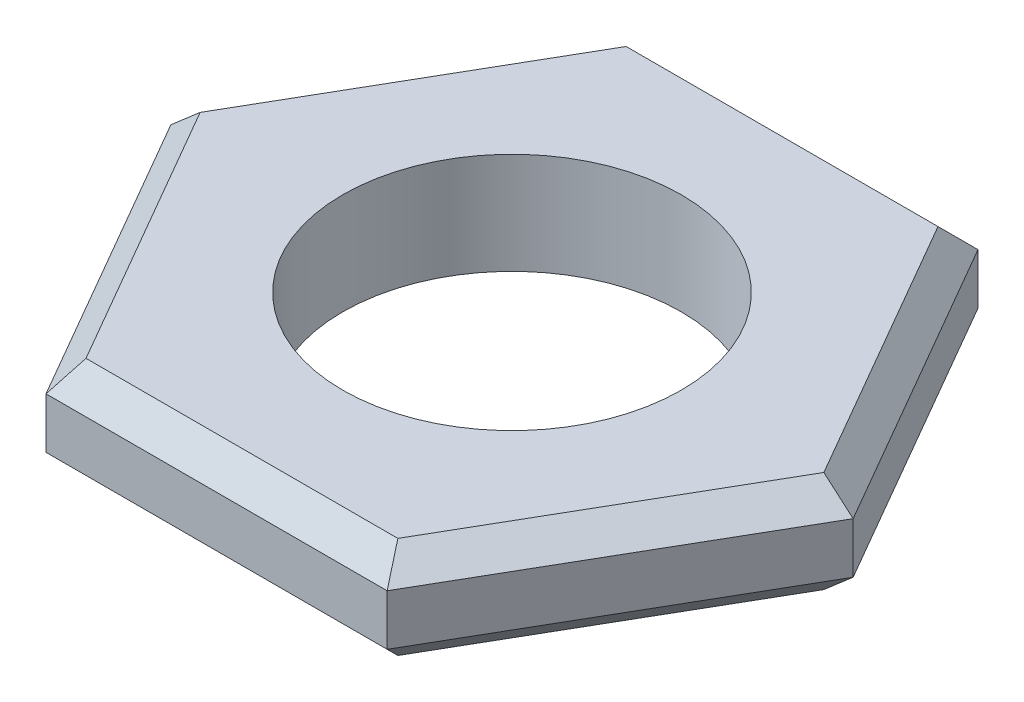
ISO-10303-21;
HEADER;
FILE_DESCRIPTION(('STEP AP214'),'2;1');
FILE_NAME('part.step','',(''),(''),'','','');
FILE_SCHEMA(('AUTOMOTIVE_DESIGN { 1 0 10303 214 1 1 1 1 }'));
ENDSEC;
DATA;
#1=APPLICATION_CONTEXT('core data for automotive mechanical design processes');
#2=APPLICATION_PROTOCOL_DEFINITION('international standard','automotive_design',2000,#1);
#3=PRODUCT_CONTEXT('',#1,'mechanical');
#4=PRODUCT('Part','Part','',(#3));
#5=PRODUCT_RELATED_PRODUCT_CATEGORY('part','',(#4));
#6=PRODUCT_DEFINITION_FORMATION('','',#4);
#7=PRODUCT_DEFINITION_CONTEXT('part definition',#1,'design');
#8=PRODUCT_DEFINITION('design','',#6,#7);
#9=PRODUCT_DEFINITION_SHAPE('','',#8);
#10=(LENGTH_UNIT() NAMED_UNIT(*) SI_UNIT(.MILLI.,.METRE.));
#11=(NAMED_UNIT(*) PLANE_ANGLE_UNIT() SI_UNIT($,.RADIAN.));
#12=(NAMED_UNIT(*) SI_UNIT($,.STERADIAN.) SOLID_ANGLE_UNIT());
#13=UNCERTAINTY_MEASURE_WITH_UNIT(LENGTH_MEASURE(1.E-05),#10,'distance_accuracy_value','');
#14=(GEOMETRIC_REPRESENTATION_CONTEXT(3) GLOBAL_UNCERTAINTY_ASSIGNED_CONTEXT((#13)) GLOBAL_UNIT_ASSIGNED_CONTEXT((#10,
#11,#12)) REPRESENTATION_CONTEXT('',''));
#15=CARTESIAN_POINT('',(0.,0.,0.));
#16=DIRECTION('',(0.,0.,1.));
#17=DIRECTION('',(1.,0.,0.));
#18=AXIS2_PLACEMENT_3D('',#15,#16,#17);
#19=CARTESIAN_POINT('',(0.,2.032,0.));
#20=DIRECTION('',(0.,1.,0.));
#21=DIRECTION('',(0.,0.,1.));
#22=AXIS2_PLACEMENT_3D('',#19,#20,#21);
#23=PLANE('',#22);
#24=DIRECTION('',(1.,0.,0.));
#25=VECTOR('',#24,1.);
#26=CARTESIAN_POINT('',(6.83374872623609,2.032,10.8204));
#27=LINE('',#26,#25);
#28=CARTESIAN_POINT('',(-6.24716085273942,2.032,10.8204));
#29=VERTEX_POINT('',#28);
#30=CARTESIAN_POINT('',(6.24716085273943,2.032,10.8204));
#31=VERTEX_POINT('',#30);
#32=EDGE_CURVE('E220',#29,#31,#27,.T.);
#33=ORIENTED_EDGE('',*,*,#32,.T.);
#34=DIRECTION('',(0.5,0.,-0.866025403784439));
#35=VECTOR('',#34,1.);
#36=CARTESIAN_POINT('',(12.7876156422272,2.032,-0.508000000000002));
#37=LINE('',#36,#35);
#38=CARTESIAN_POINT('',(12.4943217054789,2.032,0.));
#39=VERTEX_POINT('',#38);
#40=EDGE_CURVE('E11',#31,#39,#37,.T.);
#41=ORIENTED_EDGE('',*,*,#40,.T.);
#42=DIRECTION('',(-0.5,0.,-0.866025403784439));
#43=VECTOR('',#42,1.);
#44=CARTESIAN_POINT('',(5.9538669159911,2.032,-11.3284));
#45=LINE('',#44,#43);
#46=CARTESIAN_POINT('',(6.24716085273943,2.032,-10.8204));
#47=VERTEX_POINT('',#46);
#48=EDGE_CURVE('E49',#39,#47,#45,.T.);
#49=ORIENTED_EDGE('',*,*,#48,.T.);
#50=DIRECTION('',(-1.,0.,0.));
#51=VECTOR('',#50,1.);
#52=CARTESIAN_POINT('',(-6.83374872623609,2.032,-10.8204));
#53=LINE('',#52,#51);
#54=CARTESIAN_POINT('',(-6.24716085273943,2.032,-10.8204));
#55=VERTEX_POINT('',#54);
#56=EDGE_CURVE('E212',#47,#55,#53,.T.);
#57=ORIENTED_EDGE('',*,*,#56,.T.);
#58=DIRECTION('',(-0.499999999999999,0.,0.866025403784439));
#59=VECTOR('',#58,1.);
#60=CARTESIAN_POINT('',(-12.7876156422272,2.032,0.508000000000003));
#61=LINE('',#60,#59);
#62=CARTESIAN_POINT('',(-12.4943217054788,2.032,0.));
#63=VERTEX_POINT('',#62);
#64=EDGE_CURVE('E215',#55,#63,#61,.T.);
#65=ORIENTED_EDGE('',*,*,#64,.T.);
#66=DIRECTION('',(0.5,0.,0.866025403784439));
#67=VECTOR('',#66,1.);
#68=CARTESIAN_POINT('',(-5.95386691599109,2.032,11.3284));
#69=LINE('',#68,#67);
#70=EDGE_CURVE('E170',#63,#29,#69,.T.);
#71=ORIENTED_EDGE('',*,*,#70,.T.);
#72=EDGE_LOOP('',(#33,#41,#49,#57,#65,#71));
#73=FACE_BOUND('',#72,.T.);
#74=CARTESIAN_POINT('',(0.,2.032,0.));
#75=DIRECTION('',(0.,1.,0.));
#76=DIRECTION('',(0.,0.,1.));
#77=AXIS2_PLACEMENT_3D('',#74,#75,#76);
#78=CIRCLE('',#77,6.7818);
#79=CARTESIAN_POINT('',(0.,2.032,6.7818));
#80=VERTEX_POINT('',#79);
#81=EDGE_CURVE('E285',#80,#80,#78,.T.);
#82=ORIENTED_EDGE('',*,*,#81,.F.);
#83=EDGE_LOOP('',(#82));
#84=FACE_BOUND('',#83,.T.);
#85=ADVANCED_FACE('F39',(#73,#84),#23,.T.);
#86=CARTESIAN_POINT('',(0.,-2.032,0.));
#87=DIRECTION('',(0.,1.,0.));
#88=DIRECTION('',(0.,0.,1.));
#89=AXIS2_PLACEMENT_3D('',#86,#87,#88);
#90=PLANE('',#89);
#91=DIRECTION('',(-0.5,0.,-0.866025403784439));
#92=VECTOR('',#91,1.);
#93=CARTESIAN_POINT('',(-9.37074127910913,-2.032,5.4102));
#94=LINE('',#93,#92);
#95=CARTESIAN_POINT('',(-6.24716085273942,-2.032,10.8204));
#96=VERTEX_POINT('',#95);
#97=CARTESIAN_POINT('',(-12.4943217054788,-2.032,0.));
#98=VERTEX_POINT('',#97);
#99=EDGE_CURVE('E259',#96,#98,#94,.T.);
#100=ORIENTED_EDGE('',*,*,#99,.T.);
#101=DIRECTION('',(0.499999999999999,0.,-0.866025403784439));
#102=VECTOR('',#101,1.);
#103=CARTESIAN_POINT('',(-9.37074127910914,-2.032,-5.41019999999999));
#104=LINE('',#103,#102);
#105=CARTESIAN_POINT('',(-6.24716085273942,-2.032,-10.8204));
#106=VERTEX_POINT('',#105);
#107=EDGE_CURVE('E249',#98,#106,#104,.T.);
#108=ORIENTED_EDGE('',*,*,#107,.T.);
#109=DIRECTION('',(1.,0.,0.));
#110=VECTOR('',#109,1.);
#111=CARTESIAN_POINT('',(0.,-2.032,-10.8204));
#112=LINE('',#111,#110);
#113=CARTESIAN_POINT('',(6.24716085273942,-2.032,-10.8204));
#114=VERTEX_POINT('',#113);
#115=EDGE_CURVE('E253',#106,#114,#112,.T.);
#116=ORIENTED_EDGE('',*,*,#115,.T.);
#117=DIRECTION('',(0.5,0.,0.866025403784439));
#118=VECTOR('',#117,1.);
#119=CARTESIAN_POINT('',(9.37074127910914,-2.032,-5.4102));
#120=LINE('',#119,#118);
#121=CARTESIAN_POINT('',(12.4943217054788,-2.032,0.));
#122=VERTEX_POINT('',#121);
#123=EDGE_CURVE('E256',#114,#122,#120,.T.);
#124=ORIENTED_EDGE('',*,*,#123,.T.);
#125=DIRECTION('',(-0.5,0.,0.866025403784439));
#126=VECTOR('',#125,1.);
#127=CARTESIAN_POINT('',(9.37074127910914,-2.032,5.41019999999999));
#128=LINE('',#127,#126);
#129=CARTESIAN_POINT('',(6.24716085273943,-2.032,10.8204));
#130=VERTEX_POINT('',#129);
#131=EDGE_CURVE('E265',#122,#130,#128,.T.);
#132=ORIENTED_EDGE('',*,*,#131,.T.);
#133=DIRECTION('',(-1.,0.,0.));
#134=VECTOR('',#133,1.);
#135=CARTESIAN_POINT('',(0.,-2.032,10.8204));
#136=LINE('',#135,#134);
#137=EDGE_CURVE('E262',#130,#96,#136,.T.);
#138=ORIENTED_EDGE('',*,*,#137,.T.);
#139=EDGE_LOOP('',(#100,#108,#116,#124,#132,#138));
#140=FACE_BOUND('',#139,.T.);
#141=CARTESIAN_POINT('',(0.,-2.032,0.));
#142=DIRECTION('',(0.,1.,0.));
#143=DIRECTION('',(0.,0.,1.));
#144=AXIS2_PLACEMENT_3D('',#141,#142,#143);
#145=CIRCLE('',#144,6.7818);
#146=CARTESIAN_POINT('',(0.,-2.032,6.7818));
#147=VERTEX_POINT('',#146);
#148=EDGE_CURVE('E195',#147,#147,#145,.T.);
#149=ORIENTED_EDGE('',*,*,#148,.T.);
#150=EDGE_LOOP('',(#149));
#151=FACE_BOUND('',#150,.T.);
#152=ADVANCED_FACE('F297',(#140,#151),#90,.F.);
#153=CARTESIAN_POINT('',(13.6674974524722,2.032,0.));
#154=DIRECTION('',(-0.866025403784439,0.,0.5));
#155=DIRECTION('',(0.5,0.,0.866025403784439));
#156=AXIS2_PLACEMENT_3D('',#153,#154,#155);
#157=PLANE('',#156);
#158=DIRECTION('',(0.,-1.,0.));
#159=VECTOR('',#158,1.);
#160=CARTESIAN_POINT('',(13.6674974524722,2.032,0.));
#161=LINE('',#160,#159);
#162=CARTESIAN_POINT('',(13.6674974524722,1.016,0.));
#163=VERTEX_POINT('',#162);
#164=CARTESIAN_POINT('',(13.6674974524722,-1.016,0.));
#165=VERTEX_POINT('',#164);
#166=EDGE_CURVE('E281',#163,#165,#161,.T.);
#167=ORIENTED_EDGE('',*,*,#166,.T.);
#168=DIRECTION('',(-0.5,0.,-0.866025403784439));
#169=VECTOR('',#168,1.);
#170=CARTESIAN_POINT('',(13.6674974524722,-1.016,0.));
#171=LINE('',#170,#169);
#172=CARTESIAN_POINT('',(6.83374872623608,-1.016,-11.8364));
#173=VERTEX_POINT('',#172);
#174=EDGE_CURVE('E144',#165,#173,#171,.T.);
#175=ORIENTED_EDGE('',*,*,#174,.T.);
#176=DIRECTION('',(0.,-1.,0.));
#177=VECTOR('',#176,1.);
#178=CARTESIAN_POINT('',(6.83374872623608,2.032,-11.8364));
#179=LINE('',#178,#177);
#180=CARTESIAN_POINT('',(6.83374872623608,1.016,-11.8364));
#181=VERTEX_POINT('',#180);
#182=EDGE_CURVE('E167',#181,#173,#179,.T.);
#183=ORIENTED_EDGE('',*,*,#182,.F.);
#184=DIRECTION('',(0.5,0.,0.866025403784439));
#185=VECTOR('',#184,1.);
#186=CARTESIAN_POINT('',(13.6674974524722,1.016,0.));
#187=LINE('',#186,#185);
#188=EDGE_CURVE('E240',#181,#163,#187,.T.);
#189=ORIENTED_EDGE('',*,*,#188,.T.);
#190=EDGE_LOOP('',(#167,#175,#183,#189));
#191=FACE_BOUND('',#190,.T.);
#192=ADVANCED_FACE('F302',(#191),#157,.F.);
#193=CARTESIAN_POINT('',(6.83374872623608,2.032,-11.8364));
#194=DIRECTION('',(0.,0.,1.));
#195=DIRECTION('',(1.,0.,0.));
#196=AXIS2_PLACEMENT_3D('',#193,#194,#195);
#197=PLANE('',#196);
#198=ORIENTED_EDGE('',*,*,#182,.T.);
#199=DIRECTION('',(-1.,0.,0.));
#200=VECTOR('',#199,1.);
#201=CARTESIAN_POINT('',(6.83374872623608,-1.016,-11.8364));
#202=LINE('',#201,#200);
#203=CARTESIAN_POINT('',(-6.83374872623609,-1.016,-11.8364));
#204=VERTEX_POINT('',#203);
#205=EDGE_CURVE('E243',#173,#204,#202,.T.);
#206=ORIENTED_EDGE('',*,*,#205,.T.);
#207=DIRECTION('',(0.,-1.,0.));
#208=VECTOR('',#207,1.);
#209=CARTESIAN_POINT('',(-6.83374872623609,2.032,-11.8364));
#210=LINE('',#209,#208);
#211=CARTESIAN_POINT('',(-6.83374872623609,1.016,-11.8364));
#212=VERTEX_POINT('',#211);
#213=EDGE_CURVE('E156',#212,#204,#210,.T.);
#214=ORIENTED_EDGE('',*,*,#213,.F.);
#215=DIRECTION('',(1.,0.,0.));
#216=VECTOR('',#215,1.);
#217=CARTESIAN_POINT('',(6.83374872623608,1.016,-11.8364));
#218=LINE('',#217,#216);
#219=EDGE_CURVE('E246',#212,#181,#218,.T.);
#220=ORIENTED_EDGE('',*,*,#219,.T.);
#221=EDGE_LOOP('',(#198,#206,#214,#220));
#222=FACE_BOUND('',#221,.T.);
#223=ADVANCED_FACE('F319',(#222),#197,.F.);
#224=CARTESIAN_POINT('',(-6.83374872623609,2.032,-11.8364));
#225=DIRECTION('',(0.866025403784439,0.,0.499999999999999));
#226=DIRECTION('',(0.499999999999999,0.,-0.866025403784439));
#227=AXIS2_PLACEMENT_3D('',#224,#225,#226);
#228=PLANE('',#227);
#229=ORIENTED_EDGE('',*,*,#213,.T.);
#230=DIRECTION('',(-0.499999999999999,0.,0.866025403784439));
#231=VECTOR('',#230,1.);
#232=CARTESIAN_POINT('',(-6.83374872623609,-1.016,-11.8364));
#233=LINE('',#232,#231);
#234=CARTESIAN_POINT('',(-13.6674974524722,-1.016,0.));
#235=VERTEX_POINT('',#234);
#236=EDGE_CURVE('E154',#204,#235,#233,.T.);
#237=ORIENTED_EDGE('',*,*,#236,.T.);
#238=DIRECTION('',(0.,-1.,0.));
#239=VECTOR('',#238,1.);
#240=CARTESIAN_POINT('',(-13.6674974524722,2.032,0.));
#241=LINE('',#240,#239);
#242=CARTESIAN_POINT('',(-13.6674974524722,1.016,0.));
#243=VERTEX_POINT('',#242);
#244=EDGE_CURVE('E135',#243,#235,#241,.T.);
#245=ORIENTED_EDGE('',*,*,#244,.F.);
#246=DIRECTION('',(0.499999999999999,0.,-0.866025403784439));
#247=VECTOR('',#246,1.);
#248=CARTESIAN_POINT('',(-6.83374872623609,1.016,-11.8364));
#249=LINE('',#248,#247);
#250=EDGE_CURVE('E151',#243,#212,#249,.T.);
#251=ORIENTED_EDGE('',*,*,#250,.T.);
#252=EDGE_LOOP('',(#229,#237,#245,#251));
#253=FACE_BOUND('',#252,.T.);
#254=ADVANCED_FACE('F150',(#253),#228,.F.);
#255=CARTESIAN_POINT('',(-13.6674974524722,2.032,0.));
#256=DIRECTION('',(0.866025403784438,0.,-0.5));
#257=DIRECTION('',(-0.5,0.,-0.866025403784439));
#258=AXIS2_PLACEMENT_3D('',#255,#256,#257);
#259=PLANE('',#258);
#260=ORIENTED_EDGE('',*,*,#244,.T.);
#261=DIRECTION('',(0.5,0.,0.866025403784439));
#262=VECTOR('',#261,1.);
#263=CARTESIAN_POINT('',(-13.6674974524722,-1.016,0.));
#264=LINE('',#263,#262);
#265=CARTESIAN_POINT('',(-6.83374872623607,-1.016,11.8364));
#266=VERTEX_POINT('',#265);
#267=EDGE_CURVE('E143',#235,#266,#264,.T.);
#268=ORIENTED_EDGE('',*,*,#267,.T.);
#269=DIRECTION('',(0.,-1.,0.));
#270=VECTOR('',#269,1.);
#271=CARTESIAN_POINT('',(-6.83374872623607,2.032,11.8364));
#272=LINE('',#271,#270);
#273=CARTESIAN_POINT('',(-6.83374872623607,1.016,11.8364));
#274=VERTEX_POINT('',#273);
#275=EDGE_CURVE('E137',#274,#266,#272,.T.);
#276=ORIENTED_EDGE('',*,*,#275,.F.);
#277=DIRECTION('',(-0.5,0.,-0.866025403784439));
#278=VECTOR('',#277,1.);
#279=CARTESIAN_POINT('',(-13.6674974524722,1.016,0.));
#280=LINE('',#279,#278);
#281=EDGE_CURVE('E132',#274,#243,#280,.T.);
#282=ORIENTED_EDGE('',*,*,#281,.T.);
#283=EDGE_LOOP('',(#260,#268,#276,#282));
#284=FACE_BOUND('',#283,.T.);
#285=ADVANCED_FACE('F134',(#284),#259,.F.);
#286=CARTESIAN_POINT('',(-6.83374872623607,2.032,11.8364));
#287=DIRECTION('',(0.,0.,-1.));
#288=DIRECTION('',(-1.,0.,0.));
#289=AXIS2_PLACEMENT_3D('',#286,#287,#288);
#290=PLANE('',#289);
#291=ORIENTED_EDGE('',*,*,#275,.T.);
#292=DIRECTION('',(1.,0.,0.));
#293=VECTOR('',#292,1.);
#294=CARTESIAN_POINT('',(-6.83374872623607,-1.016,11.8364));
#295=LINE('',#294,#293);
#296=CARTESIAN_POINT('',(6.83374872623609,-1.016,11.8364));
#297=VERTEX_POINT('',#296);
#298=EDGE_CURVE('E230',#266,#297,#295,.T.);
#299=ORIENTED_EDGE('',*,*,#298,.T.);
#300=DIRECTION('',(0.,-1.,0.));
#301=VECTOR('',#300,1.);
#302=CARTESIAN_POINT('',(6.83374872623609,2.032,11.8364));
#303=LINE('',#302,#301);
#304=CARTESIAN_POINT('',(6.83374872623609,1.016,11.8364));
#305=VERTEX_POINT('',#304);
#306=EDGE_CURVE('E277',#305,#297,#303,.T.);
#307=ORIENTED_EDGE('',*,*,#306,.F.);
#308=DIRECTION('',(-1.,0.,0.));
#309=VECTOR('',#308,1.);
#310=CARTESIAN_POINT('',(-6.83374872623607,1.016,11.8364));
#311=LINE('',#310,#309);
#312=EDGE_CURVE('E233',#305,#274,#311,.T.);
#313=ORIENTED_EDGE('',*,*,#312,.T.);
#314=EDGE_LOOP('',(#291,#299,#307,#313));
#315=FACE_BOUND('',#314,.T.);
#316=ADVANCED_FACE('F310',(#315),#290,.F.);
#317=CARTESIAN_POINT('',(6.83374872623609,2.032,11.8364));
#318=DIRECTION('',(-0.866025403784439,0.,-0.5));
#319=DIRECTION('',(-0.5,0.,0.866025403784439));
#320=AXIS2_PLACEMENT_3D('',#317,#318,#319);
#321=PLANE('',#320);
#322=ORIENTED_EDGE('',*,*,#306,.T.);
#323=DIRECTION('',(0.5,0.,-0.866025403784439));
#324=VECTOR('',#323,1.);
#325=CARTESIAN_POINT('',(6.83374872623609,-1.016,11.8364));
#326=LINE('',#325,#324);
#327=EDGE_CURVE('E223',#297,#165,#326,.T.);
#328=ORIENTED_EDGE('',*,*,#327,.T.);
#329=ORIENTED_EDGE('',*,*,#166,.F.);
#330=DIRECTION('',(-0.5,0.,0.866025403784439));
#331=VECTOR('',#330,1.);
#332=CARTESIAN_POINT('',(6.83374872623609,1.016,11.8364));
#333=LINE('',#332,#331);
#334=EDGE_CURVE('E226',#163,#305,#333,.T.);
#335=ORIENTED_EDGE('',*,*,#334,.T.);
#336=EDGE_LOOP('',(#322,#328,#329,#335));
#337=FACE_BOUND('',#336,.T.);
#338=ADVANCED_FACE('F307',(#337),#321,.F.);
#339=CARTESIAN_POINT('',(0.,2.032,0.));
#340=DIRECTION('',(0.,-1.,0.));
#341=DIRECTION('',(0.,0.,-1.));
#342=AXIS2_PLACEMENT_3D('',#339,#340,#341);
#343=CYLINDRICAL_SURFACE('',#342,6.7818);
#344=ORIENTED_EDGE('',*,*,#81,.T.);
#345=EDGE_LOOP('',(#344));
#346=FACE_BOUND('',#345,.T.);
#347=ORIENTED_EDGE('',*,*,#148,.F.);
#348=EDGE_LOOP('',(#347));
#349=FACE_BOUND('',#348,.T.);
#350=ADVANCED_FACE('F293',(#346,#349),#343,.F.);
#351=CARTESIAN_POINT('',(6.83374872623609,-1.016,11.8364));
#352=DIRECTION('',(-0.612372435695794,0.707106781186549,-0.353553390593273));
#353=DIRECTION('',(0.5,0.,-0.866025403784439));
#354=AXIS2_PLACEMENT_3D('',#351,#352,#353);
#355=PLANE('',#354);
#356=DIRECTION('',(-0.377964473009228,-0.654653670707975,-0.654653670707979));
#357=VECTOR('',#356,1.);
#358=CARTESIAN_POINT('',(6.83374872623609,-1.016,11.8364));
#359=LINE('',#358,#357);
#360=EDGE_CURVE('E196',#130,#297,#359,.F.);
#361=ORIENTED_EDGE('',*,*,#360,.F.);
#362=ORIENTED_EDGE('',*,*,#131,.F.);
#363=DIRECTION('',(0.755928946018456,0.654653670707976,0.));
#364=VECTOR('',#363,1.);
#365=CARTESIAN_POINT('',(9.76249818033725,-4.39782857142858,0.));
#366=LINE('',#365,#364);
#367=EDGE_CURVE('E191',#165,#122,#366,.F.);
#368=ORIENTED_EDGE('',*,*,#367,.F.);
#369=ORIENTED_EDGE('',*,*,#327,.F.);
#370=EDGE_LOOP('',(#361,#362,#368,#369));
#371=FACE_BOUND('',#370,.T.);
#372=ADVANCED_FACE('F345',(#371),#355,.F.);
#373=CARTESIAN_POINT('',(13.6674974524722,-1.016,0.));
#374=DIRECTION('',(-0.612372435695793,0.707106781186549,0.353553390593273));
#375=DIRECTION('',(-0.5,0.,-0.866025403784439));
#376=AXIS2_PLACEMENT_3D('',#373,#374,#375);
#377=PLANE('',#376);
#378=ORIENTED_EDGE('',*,*,#367,.T.);
#379=ORIENTED_EDGE('',*,*,#123,.F.);
#380=DIRECTION('',(0.377964473009228,0.654653670707975,-0.654653670707979));
#381=VECTOR('',#380,1.);
#382=CARTESIAN_POINT('',(4.88124909016862,-4.39782857142858,-8.45457142857141));
#383=LINE('',#382,#381);
#384=EDGE_CURVE('E200',#173,#114,#383,.F.);
#385=ORIENTED_EDGE('',*,*,#384,.F.);
#386=ORIENTED_EDGE('',*,*,#174,.F.);
#387=EDGE_LOOP('',(#378,#379,#385,#386));
#388=FACE_BOUND('',#387,.T.);
#389=ADVANCED_FACE('F341',(#388),#377,.F.);
#390=CARTESIAN_POINT('',(-6.83374872623607,-1.016,11.8364));
#391=DIRECTION('',(0.,0.707106781186549,-0.707106781186546));
#392=DIRECTION('',(1.,0.,0.));
#393=AXIS2_PLACEMENT_3D('',#390,#391,#392);
#394=PLANE('',#393);
#395=ORIENTED_EDGE('',*,*,#360,.T.);
#396=ORIENTED_EDGE('',*,*,#298,.F.);
#397=DIRECTION('',(0.377964473009228,-0.654653670707975,-0.654653670707979));
#398=VECTOR('',#397,1.);
#399=CARTESIAN_POINT('',(-6.83374872623607,-1.016,11.8364));
#400=LINE('',#399,#398);
#401=EDGE_CURVE('E204',#96,#266,#400,.F.);
#402=ORIENTED_EDGE('',*,*,#401,.F.);
#403=ORIENTED_EDGE('',*,*,#137,.F.);
#404=EDGE_LOOP('',(#395,#396,#402,#403));
#405=FACE_BOUND('',#404,.T.);
#406=ADVANCED_FACE('F337',(#405),#394,.F.);
#407=CARTESIAN_POINT('',(6.83374872623608,-1.016,-11.8364));
#408=DIRECTION('',(0.,0.707106781186549,0.707106781186546));
#409=DIRECTION('',(-1.,0.,0.));
#410=AXIS2_PLACEMENT_3D('',#407,#408,#409);
#411=PLANE('',#410);
#412=ORIENTED_EDGE('',*,*,#384,.T.);
#413=ORIENTED_EDGE('',*,*,#115,.F.);
#414=DIRECTION('',(-0.377964473009229,0.654653670707975,-0.654653670707978));
#415=VECTOR('',#414,1.);
#416=CARTESIAN_POINT('',(-4.88124909016862,-4.39782857142858,-8.45457142857141));
#417=LINE('',#416,#415);
#418=EDGE_CURVE('E175',#204,#106,#417,.F.);
#419=ORIENTED_EDGE('',*,*,#418,.F.);
#420=ORIENTED_EDGE('',*,*,#205,.F.);
#421=EDGE_LOOP('',(#412,#413,#419,#420));
#422=FACE_BOUND('',#421,.T.);
#423=ADVANCED_FACE('F333',(#422),#411,.F.);
#424=CARTESIAN_POINT('',(-13.6674974524722,-1.016,0.));
#425=DIRECTION('',(0.612372435695793,0.707106781186549,-0.353553390593273));
#426=DIRECTION('',(0.5,0.,0.866025403784439));
#427=AXIS2_PLACEMENT_3D('',#424,#425,#426);
#428=PLANE('',#427);
#429=ORIENTED_EDGE('',*,*,#401,.T.);
#430=ORIENTED_EDGE('',*,*,#267,.F.);
#431=DIRECTION('',(0.755928946018456,-0.654653670707975,0.));
#432=VECTOR('',#431,1.);
#433=CARTESIAN_POINT('',(-13.6674974524722,-1.016,0.));
#434=LINE('',#433,#432);
#435=EDGE_CURVE('E172',#98,#235,#434,.F.);
#436=ORIENTED_EDGE('',*,*,#435,.F.);
#437=ORIENTED_EDGE('',*,*,#99,.F.);
#438=EDGE_LOOP('',(#429,#430,#436,#437));
#439=FACE_BOUND('',#438,.T.);
#440=ADVANCED_FACE('F329',(#439),#428,.F.);
#441=CARTESIAN_POINT('',(-6.83374872623609,-1.016,-11.8364));
#442=DIRECTION('',(0.612372435695793,0.707106781186549,0.353553390593272));
#443=DIRECTION('',(-0.499999999999999,0.,0.866025403784439));
#444=AXIS2_PLACEMENT_3D('',#441,#442,#443);
#445=PLANE('',#444);
#446=ORIENTED_EDGE('',*,*,#418,.T.);
#447=ORIENTED_EDGE('',*,*,#107,.F.);
#448=ORIENTED_EDGE('',*,*,#435,.T.);
#449=ORIENTED_EDGE('',*,*,#236,.F.);
#450=EDGE_LOOP('',(#446,#447,#448,#449));
#451=FACE_BOUND('',#450,.T.);
#452=ADVANCED_FACE('F326',(#451),#445,.F.);
#453=CARTESIAN_POINT('',(-9.37074127910914,2.032,-5.41019999999999));
#454=DIRECTION('',(-0.612372435695795,0.707106781186547,-0.353553390593273));
#455=DIRECTION('',(0.499999999999999,0.,-0.866025403784439));
#456=AXIS2_PLACEMENT_3D('',#453,#454,#455);
#457=PLANE('',#456);
#458=DIRECTION('',(-0.377964473009227,-0.654653670707977,-0.654653670707977));
#459=VECTOR('',#458,1.);
#460=CARTESIAN_POINT('',(-5.35470930234808,3.57777142857143,-9.27462857142857));
#461=LINE('',#460,#459);
#462=EDGE_CURVE('E164',#212,#55,#461,.F.);
#463=ORIENTED_EDGE('',*,*,#462,.F.);
#464=ORIENTED_EDGE('',*,*,#250,.F.);
#465=DIRECTION('',(-0.755928946018454,-0.654653670707977,0.));
#466=VECTOR('',#465,1.);
#467=CARTESIAN_POINT('',(-10.7094186046962,3.57777142857143,0.));
#468=LINE('',#467,#466);
#469=EDGE_CURVE('E43',#63,#243,#468,.T.);
#470=ORIENTED_EDGE('',*,*,#469,.F.);
#471=ORIENTED_EDGE('',*,*,#64,.F.);
#472=EDGE_LOOP('',(#463,#464,#470,#471));
#473=FACE_BOUND('',#472,.T.);
#474=ADVANCED_FACE('F41',(#473),#457,.T.);
#475=CARTESIAN_POINT('',(-9.37074127910914,2.032,5.4102));
#476=DIRECTION('',(-0.612372435695795,0.707106781186547,0.353553390593274));
#477=DIRECTION('',(-0.5,0.,-0.866025403784439));
#478=AXIS2_PLACEMENT_3D('',#475,#476,#477);
#479=PLANE('',#478);
#480=ORIENTED_EDGE('',*,*,#469,.T.);
#481=ORIENTED_EDGE('',*,*,#281,.F.);
#482=DIRECTION('',(-0.377964473009227,-0.654653670707977,0.654653670707977));
#483=VECTOR('',#482,1.);
#484=CARTESIAN_POINT('',(-5.35470930234808,3.57777142857143,9.27462857142858));
#485=LINE('',#484,#483);
#486=EDGE_CURVE('E177',#29,#274,#485,.T.);
#487=ORIENTED_EDGE('',*,*,#486,.F.);
#488=ORIENTED_EDGE('',*,*,#70,.F.);
#489=EDGE_LOOP('',(#480,#481,#487,#488));
#490=FACE_BOUND('',#489,.T.);
#491=ADVANCED_FACE('F169',(#490),#479,.T.);
#492=CARTESIAN_POINT('',(0.,2.032,-10.8204));
#493=DIRECTION('',(0.,0.707106781186548,-0.707106781186548));
#494=DIRECTION('',(1.,0.,0.));
#495=AXIS2_PLACEMENT_3D('',#492,#493,#494);
#496=PLANE('',#495);
#497=ORIENTED_EDGE('',*,*,#462,.T.);
#498=ORIENTED_EDGE('',*,*,#56,.F.);
#499=DIRECTION('',(0.377964473009227,-0.654653670707977,-0.654653670707977));
#500=VECTOR('',#499,1.);
#501=CARTESIAN_POINT('',(5.35470930234808,3.57777142857143,-9.27462857142858));
#502=LINE('',#501,#500);
#503=EDGE_CURVE('E180',#181,#47,#502,.F.);
#504=ORIENTED_EDGE('',*,*,#503,.F.);
#505=ORIENTED_EDGE('',*,*,#219,.F.);
#506=EDGE_LOOP('',(#497,#498,#504,#505));
#507=FACE_BOUND('',#506,.T.);
#508=ADVANCED_FACE('F360',(#507),#496,.T.);
#509=CARTESIAN_POINT('',(0.,2.032,10.8204));
#510=DIRECTION('',(0.,0.707106781186548,0.707106781186548));
#511=DIRECTION('',(-1.,0.,0.));
#512=AXIS2_PLACEMENT_3D('',#509,#510,#511);
#513=PLANE('',#512);
#514=ORIENTED_EDGE('',*,*,#486,.T.);
#515=ORIENTED_EDGE('',*,*,#312,.F.);
#516=DIRECTION('',(-0.377964473009226,0.654653670707978,-0.654653670707977));
#517=VECTOR('',#516,1.);
#518=CARTESIAN_POINT('',(5.35470930234809,3.57777142857143,9.27462857142858));
#519=LINE('',#518,#517);
#520=EDGE_CURVE('E186',#31,#305,#519,.F.);
#521=ORIENTED_EDGE('',*,*,#520,.F.);
#522=ORIENTED_EDGE('',*,*,#32,.F.);
#523=EDGE_LOOP('',(#514,#515,#521,#522));
#524=FACE_BOUND('',#523,.T.);
#525=ADVANCED_FACE('F356',(#524),#513,.T.);
#526=CARTESIAN_POINT('',(9.37074127910914,2.032,-5.4102));
#527=DIRECTION('',(0.612372435695795,0.707106781186547,-0.353553390593274));
#528=DIRECTION('',(0.5,0.,0.866025403784439));
#529=AXIS2_PLACEMENT_3D('',#526,#527,#528);
#530=PLANE('',#529);
#531=ORIENTED_EDGE('',*,*,#503,.T.);
#532=ORIENTED_EDGE('',*,*,#48,.F.);
#533=DIRECTION('',(0.755928946018454,-0.654653670707978,0.));
#534=VECTOR('',#533,1.);
#535=CARTESIAN_POINT('',(10.7094186046962,3.57777142857143,0.));
#536=LINE('',#535,#534);
#537=EDGE_CURVE('E57',#163,#39,#536,.F.);
#538=ORIENTED_EDGE('',*,*,#537,.F.);
#539=ORIENTED_EDGE('',*,*,#188,.F.);
#540=EDGE_LOOP('',(#531,#532,#538,#539));
#541=FACE_BOUND('',#540,.T.);
#542=ADVANCED_FACE('F353',(#541),#530,.T.);
#543=CARTESIAN_POINT('',(9.37074127910915,2.032,5.4102));
#544=DIRECTION('',(0.612372435695795,0.707106781186547,0.353553390593274));
#545=DIRECTION('',(-0.5,0.,0.866025403784439));
#546=AXIS2_PLACEMENT_3D('',#543,#544,#545);
#547=PLANE('',#546);
#548=ORIENTED_EDGE('',*,*,#520,.T.);
#549=ORIENTED_EDGE('',*,*,#334,.F.);
#550=ORIENTED_EDGE('',*,*,#537,.T.);
#551=ORIENTED_EDGE('',*,*,#40,.F.);
#552=EDGE_LOOP('',(#548,#549,#550,#551));
#553=FACE_BOUND('',#552,.T.);
#554=ADVANCED_FACE('F350',(#553),#547,.T.);
#555=CLOSED_SHELL('',(#85,#152,#192,#223,#254,#285,#316,#338,#350,#372,#389,#406,#423,#440,#452,
#474,#491,#508,#525,#542,#554));
#556=MANIFOLD_SOLID_BREP('B2',#555);
#557=ADVANCED_BREP_SHAPE_REPRESENTATION('',(#18,#556),#14);
#558=SHAPE_DEFINITION_REPRESENTATION(#9,#557);
ENDSEC;
END-ISO-10303-21;
